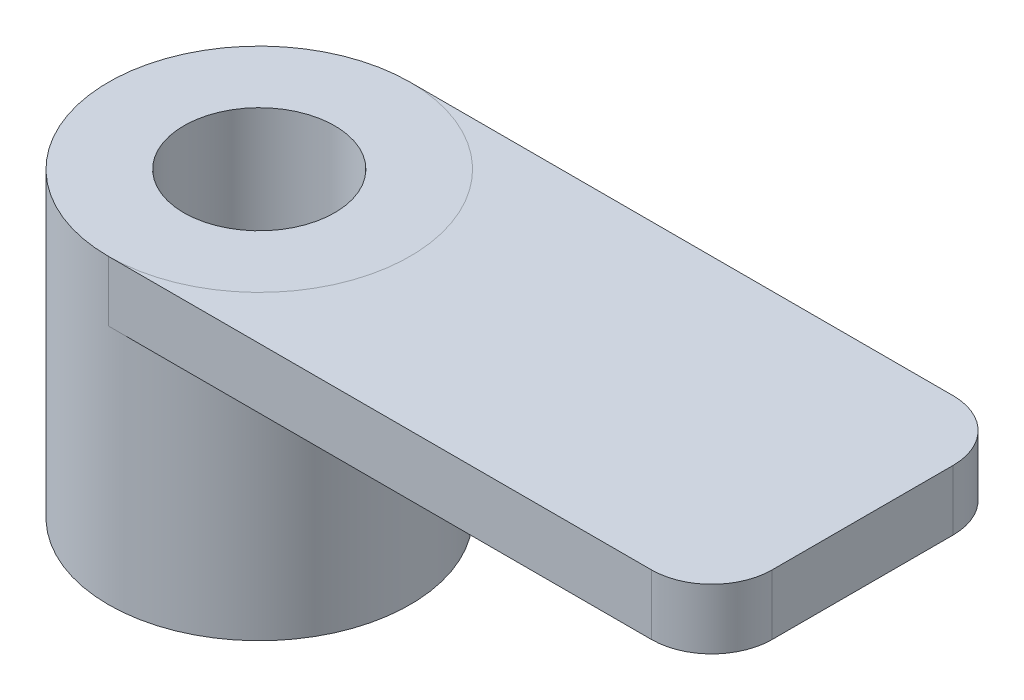
ISO-10303-21;
HEADER;
FILE_DESCRIPTION(('STEP AP214'),'2;1');
FILE_NAME('part.step','',(''),(''),'','','');
FILE_SCHEMA(('AUTOMOTIVE_DESIGN { 1 0 10303 214 1 1 1 1 }'));
ENDSEC;
DATA;
#1=APPLICATION_CONTEXT('core data for automotive mechanical design processes');
#2=APPLICATION_PROTOCOL_DEFINITION('international standard','automotive_design',2000,#1);
#3=PRODUCT_CONTEXT('',#1,'mechanical');
#4=PRODUCT('Part','Part','',(#3));
#5=PRODUCT_RELATED_PRODUCT_CATEGORY('part','',(#4));
#6=PRODUCT_DEFINITION_FORMATION('','',#4);
#7=PRODUCT_DEFINITION_CONTEXT('part definition',#1,'design');
#8=PRODUCT_DEFINITION('design','',#6,#7);
#9=PRODUCT_DEFINITION_SHAPE('','',#8);
#10=(LENGTH_UNIT() NAMED_UNIT(*) SI_UNIT(.MILLI.,.METRE.));
#11=(NAMED_UNIT(*) PLANE_ANGLE_UNIT() SI_UNIT($,.RADIAN.));
#12=(NAMED_UNIT(*) SI_UNIT($,.STERADIAN.) SOLID_ANGLE_UNIT());
#13=UNCERTAINTY_MEASURE_WITH_UNIT(LENGTH_MEASURE(1.E-05),#10,'distance_accuracy_value','');
#14=(GEOMETRIC_REPRESENTATION_CONTEXT(3) GLOBAL_UNCERTAINTY_ASSIGNED_CONTEXT((#13)) GLOBAL_UNIT_ASSIGNED_CONTEXT((#10,
#11,#12)) REPRESENTATION_CONTEXT('',''));
#15=CARTESIAN_POINT('',(0.,0.,0.));
#16=DIRECTION('',(0.,0.,1.));
#17=DIRECTION('',(1.,0.,0.));
#18=AXIS2_PLACEMENT_3D('',#15,#16,#17);
#19=CARTESIAN_POINT('',(0.,10.16,0.));
#20=DIRECTION('',(0.,1.,0.));
#21=DIRECTION('',(0.,0.,1.));
#22=AXIS2_PLACEMENT_3D('',#19,#20,#21);
#23=CYLINDRICAL_SURFACE('',#22,6.35);
#24=CARTESIAN_POINT('',(0.,12.7,0.));
#25=DIRECTION('',(0.,-1.,0.));
#26=DIRECTION('',(0.,0.,1.));
#27=AXIS2_PLACEMENT_3D('',#24,#25,#26);
#28=CIRCLE('',#27,6.35);
#29=CARTESIAN_POINT('',(0.,12.7,-6.35));
#30=VERTEX_POINT('',#29);
#31=CARTESIAN_POINT('',(0.,12.7,6.35));
#32=VERTEX_POINT('',#31);
#33=EDGE_CURVE('E124',#30,#32,#28,.T.);
#34=ORIENTED_EDGE('',*,*,#33,.F.);
#35=DIRECTION('',(0.,1.,0.));
#36=VECTOR('',#35,1.);
#37=CARTESIAN_POINT('',(0.,10.16,-6.35));
#38=LINE('',#37,#36);
#39=CARTESIAN_POINT('',(0.,10.16,-6.35));
#40=VERTEX_POINT('',#39);
#41=EDGE_CURVE('E106',#40,#30,#38,.T.);
#42=ORIENTED_EDGE('',*,*,#41,.F.);
#43=CARTESIAN_POINT('',(0.,10.16,0.));
#44=DIRECTION('',(0.,-1.,0.));
#45=DIRECTION('',(0.,0.,1.));
#46=AXIS2_PLACEMENT_3D('',#43,#44,#45);
#47=CIRCLE('',#46,6.35);
#48=CARTESIAN_POINT('',(0.,10.16,6.35));
#49=VERTEX_POINT('',#48);
#50=EDGE_CURVE('E111',#40,#49,#47,.T.);
#51=ORIENTED_EDGE('',*,*,#50,.T.);
#52=DIRECTION('',(0.,1.,0.));
#53=VECTOR('',#52,1.);
#54=CARTESIAN_POINT('',(0.,10.16,6.35));
#55=LINE('',#54,#53);
#56=EDGE_CURVE('E94',#49,#32,#55,.T.);
#57=ORIENTED_EDGE('',*,*,#56,.T.);
#58=EDGE_LOOP('',(#34,#42,#51,#57));
#59=FACE_BOUND('',#58,.T.);
#60=ADVANCED_FACE('F41',(#59),#23,.F.);
#61=CARTESIAN_POINT('',(0.,10.16,-6.35));
#62=DIRECTION('',(0.,0.,-1.));
#63=DIRECTION('',(-1.,0.,0.));
#64=AXIS2_PLACEMENT_3D('',#61,#62,#63);
#65=PLANE('',#64);
#66=DIRECTION('',(-1.,0.,0.));
#67=VECTOR('',#66,1.);
#68=CARTESIAN_POINT('',(0.,12.7,-6.35));
#69=LINE('',#68,#67);
#70=CARTESIAN_POINT('',(22.86,12.7,-6.35));
#71=VERTEX_POINT('',#70);
#72=EDGE_CURVE('E117',#71,#30,#69,.T.);
#73=ORIENTED_EDGE('',*,*,#72,.F.);
#74=DIRECTION('',(0.,1.,0.));
#75=VECTOR('',#74,1.);
#76=CARTESIAN_POINT('',(22.86,10.16,-6.35));
#77=LINE('',#76,#75);
#78=CARTESIAN_POINT('',(22.86,10.16,-6.35));
#79=VERTEX_POINT('',#78);
#80=EDGE_CURVE('E12',#71,#79,#77,.F.);
#81=ORIENTED_EDGE('',*,*,#80,.T.);
#82=DIRECTION('',(-1.,0.,0.));
#83=VECTOR('',#82,1.);
#84=CARTESIAN_POINT('',(0.,10.16,-6.35));
#85=LINE('',#84,#83);
#86=EDGE_CURVE('E107',#79,#40,#85,.T.);
#87=ORIENTED_EDGE('',*,*,#86,.T.);
#88=ORIENTED_EDGE('',*,*,#41,.T.);
#89=EDGE_LOOP('',(#73,#81,#87,#88));
#90=FACE_BOUND('',#89,.T.);
#91=ADVANCED_FACE('F150',(#90),#65,.T.);
#92=CARTESIAN_POINT('',(25.4,10.16,-6.35));
#93=DIRECTION('',(1.,0.,0.));
#94=DIRECTION('',(0.,0.,-1.));
#95=AXIS2_PLACEMENT_3D('',#92,#93,#94);
#96=PLANE('',#95);
#97=DIRECTION('',(0.,0.,-1.));
#98=VECTOR('',#97,1.);
#99=CARTESIAN_POINT('',(25.4,12.7,-6.35));
#100=LINE('',#99,#98);
#101=CARTESIAN_POINT('',(25.4,12.7,3.81));
#102=VERTEX_POINT('',#101);
#103=CARTESIAN_POINT('',(25.4,12.7,-3.81));
#104=VERTEX_POINT('',#103);
#105=EDGE_CURVE('E119',#102,#104,#100,.T.);
#106=ORIENTED_EDGE('',*,*,#105,.F.);
#107=DIRECTION('',(0.,1.,0.));
#108=VECTOR('',#107,1.);
#109=CARTESIAN_POINT('',(25.4,10.16,3.81));
#110=LINE('',#109,#108);
#111=CARTESIAN_POINT('',(25.4,10.16,3.81));
#112=VERTEX_POINT('',#111);
#113=EDGE_CURVE('E139',#102,#112,#110,.F.);
#114=ORIENTED_EDGE('',*,*,#113,.T.);
#115=DIRECTION('',(0.,0.,-1.));
#116=VECTOR('',#115,1.);
#117=CARTESIAN_POINT('',(25.4,10.16,-6.35));
#118=LINE('',#117,#116);
#119=CARTESIAN_POINT('',(25.4,10.16,-3.81));
#120=VERTEX_POINT('',#119);
#121=EDGE_CURVE('E113',#112,#120,#118,.T.);
#122=ORIENTED_EDGE('',*,*,#121,.T.);
#123=DIRECTION('',(0.,1.,0.));
#124=VECTOR('',#123,1.);
#125=CARTESIAN_POINT('',(25.4,10.16,-3.81));
#126=LINE('',#125,#124);
#127=EDGE_CURVE('E136',#120,#104,#126,.T.);
#128=ORIENTED_EDGE('',*,*,#127,.T.);
#129=EDGE_LOOP('',(#106,#114,#122,#128));
#130=FACE_BOUND('',#129,.T.);
#131=ADVANCED_FACE('F144',(#130),#96,.T.);
#132=CARTESIAN_POINT('',(25.4,10.16,6.35));
#133=DIRECTION('',(0.,0.,1.));
#134=DIRECTION('',(1.,0.,0.));
#135=AXIS2_PLACEMENT_3D('',#132,#133,#134);
#136=PLANE('',#135);
#137=DIRECTION('',(1.,0.,0.));
#138=VECTOR('',#137,1.);
#139=CARTESIAN_POINT('',(25.4,10.16,6.35));
#140=LINE('',#139,#138);
#141=CARTESIAN_POINT('',(22.86,10.16,6.35));
#142=VERTEX_POINT('',#141);
#143=EDGE_CURVE('E98',#49,#142,#140,.T.);
#144=ORIENTED_EDGE('',*,*,#143,.T.);
#145=DIRECTION('',(0.,1.,0.));
#146=VECTOR('',#145,1.);
#147=CARTESIAN_POINT('',(22.86,10.16,6.35));
#148=LINE('',#147,#146);
#149=CARTESIAN_POINT('',(22.86,12.7,6.35));
#150=VERTEX_POINT('',#149);
#151=EDGE_CURVE('E129',#142,#150,#148,.T.);
#152=ORIENTED_EDGE('',*,*,#151,.T.);
#153=DIRECTION('',(1.,0.,0.));
#154=VECTOR('',#153,1.);
#155=CARTESIAN_POINT('',(25.4,12.7,6.35));
#156=LINE('',#155,#154);
#157=EDGE_CURVE('E101',#32,#150,#156,.T.);
#158=ORIENTED_EDGE('',*,*,#157,.F.);
#159=ORIENTED_EDGE('',*,*,#56,.F.);
#160=EDGE_LOOP('',(#144,#152,#158,#159));
#161=FACE_BOUND('',#160,.T.);
#162=ADVANCED_FACE('F96',(#161),#136,.T.);
#163=CARTESIAN_POINT('',(0.,10.16,0.));
#164=DIRECTION('',(0.,1.,0.));
#165=DIRECTION('',(0.,0.,1.));
#166=AXIS2_PLACEMENT_3D('',#163,#164,#165);
#167=PLANE('',#166);
#168=ORIENTED_EDGE('',*,*,#121,.F.);
#169=CARTESIAN_POINT('',(22.86,10.16,3.81));
#170=DIRECTION('',(0.,1.,0.));
#171=DIRECTION('',(0.,0.,1.));
#172=AXIS2_PLACEMENT_3D('',#169,#170,#171);
#173=CIRCLE('',#172,2.54);
#174=EDGE_CURVE('E49',#112,#142,#173,.F.);
#175=ORIENTED_EDGE('',*,*,#174,.T.);
#176=ORIENTED_EDGE('',*,*,#143,.F.);
#177=ORIENTED_EDGE('',*,*,#50,.F.);
#178=ORIENTED_EDGE('',*,*,#86,.F.);
#179=CARTESIAN_POINT('',(22.86,10.16,-3.81));
#180=DIRECTION('',(0.,1.,0.));
#181=DIRECTION('',(0.,0.,1.));
#182=AXIS2_PLACEMENT_3D('',#179,#180,#181);
#183=CIRCLE('',#182,2.54);
#184=EDGE_CURVE('E61',#79,#120,#183,.F.);
#185=ORIENTED_EDGE('',*,*,#184,.T.);
#186=EDGE_LOOP('',(#168,#175,#176,#177,#178,#185));
#187=FACE_BOUND('',#186,.T.);
#188=ADVANCED_FACE('F110',(#187),#167,.F.);
#189=CARTESIAN_POINT('',(0.,12.7,0.));
#190=DIRECTION('',(0.,1.,0.));
#191=DIRECTION('',(0.,0.,1.));
#192=AXIS2_PLACEMENT_3D('',#189,#190,#191);
#193=PLANE('',#192);
#194=ORIENTED_EDGE('',*,*,#157,.T.);
#195=CARTESIAN_POINT('',(22.86,12.7,3.81));
#196=DIRECTION('',(0.,1.,0.));
#197=DIRECTION('',(0.,0.,1.));
#198=AXIS2_PLACEMENT_3D('',#195,#196,#197);
#199=CIRCLE('',#198,2.54);
#200=EDGE_CURVE('E134',#150,#102,#199,.T.);
#201=ORIENTED_EDGE('',*,*,#200,.T.);
#202=ORIENTED_EDGE('',*,*,#105,.T.);
#203=CARTESIAN_POINT('',(22.86,12.7,-3.81));
#204=DIRECTION('',(0.,1.,0.));
#205=DIRECTION('',(0.,0.,1.));
#206=AXIS2_PLACEMENT_3D('',#203,#204,#205);
#207=CIRCLE('',#206,2.54);
#208=EDGE_CURVE('E132',#104,#71,#207,.T.);
#209=ORIENTED_EDGE('',*,*,#208,.T.);
#210=ORIENTED_EDGE('',*,*,#72,.T.);
#211=ORIENTED_EDGE('',*,*,#33,.T.);
#212=EDGE_LOOP('',(#194,#201,#202,#209,#210,#211));
#213=FACE_BOUND('',#212,.T.);
#214=ADVANCED_FACE('F149',(#213),#193,.T.);
#215=CARTESIAN_POINT('',(22.86,10.16,3.81));
#216=DIRECTION('',(0.,1.,0.));
#217=DIRECTION('',(0.,0.,1.));
#218=AXIS2_PLACEMENT_3D('',#215,#216,#217);
#219=CYLINDRICAL_SURFACE('',#218,2.54);
#220=ORIENTED_EDGE('',*,*,#174,.F.);
#221=ORIENTED_EDGE('',*,*,#113,.F.);
#222=ORIENTED_EDGE('',*,*,#200,.F.);
#223=ORIENTED_EDGE('',*,*,#151,.F.);
#224=EDGE_LOOP('',(#220,#221,#222,#223));
#225=FACE_BOUND('',#224,.T.);
#226=ADVANCED_FACE('F147',(#225),#219,.T.);
#227=CARTESIAN_POINT('',(22.86,10.16,-3.81));
#228=DIRECTION('',(0.,1.,0.));
#229=DIRECTION('',(0.,0.,1.));
#230=AXIS2_PLACEMENT_3D('',#227,#228,#229);
#231=CYLINDRICAL_SURFACE('',#230,2.54);
#232=ORIENTED_EDGE('',*,*,#184,.F.);
#233=ORIENTED_EDGE('',*,*,#80,.F.);
#234=ORIENTED_EDGE('',*,*,#208,.F.);
#235=ORIENTED_EDGE('',*,*,#127,.F.);
#236=EDGE_LOOP('',(#232,#233,#234,#235));
#237=FACE_BOUND('',#236,.T.);
#238=ADVANCED_FACE('F43',(#237),#231,.T.);
#239=CLOSED_SHELL('',(#60,#91,#131,#162,#188,#214,#226,#238));
#240=MANIFOLD_SOLID_BREP('B2',#239);
#241=CARTESIAN_POINT('',(0.,12.7,0.));
#242=DIRECTION('',(0.,1.,0.));
#243=DIRECTION('',(0.,0.,1.));
#244=AXIS2_PLACEMENT_3D('',#241,#242,#243);
#245=PLANE('',#244);
#246=CARTESIAN_POINT('',(0.,12.7,0.));
#247=DIRECTION('',(0.,1.,0.));
#248=DIRECTION('',(0.,0.,1.));
#249=AXIS2_PLACEMENT_3D('',#246,#247,#248);
#250=CIRCLE('',#249,6.35);
#251=CARTESIAN_POINT('',(0.,12.7,6.35));
#252=VERTEX_POINT('',#251);
#253=EDGE_CURVE('E40',#252,#252,#250,.T.);
#254=ORIENTED_EDGE('',*,*,#253,.T.);
#255=EDGE_LOOP('',(#254));
#256=FACE_BOUND('',#255,.T.);
#257=CARTESIAN_POINT('',(0.,12.7,0.));
#258=DIRECTION('',(0.,1.,0.));
#259=DIRECTION('',(0.,0.,1.));
#260=AXIS2_PLACEMENT_3D('',#257,#258,#259);
#261=CIRCLE('',#260,3.175);
#262=CARTESIAN_POINT('',(0.,12.7,3.175));
#263=VERTEX_POINT('',#262);
#264=EDGE_CURVE('E228',#263,#263,#261,.T.);
#265=ORIENTED_EDGE('',*,*,#264,.F.);
#266=EDGE_LOOP('',(#265));
#267=FACE_BOUND('',#266,.T.);
#268=ADVANCED_FACE('F217',(#256,#267),#245,.T.);
#269=CARTESIAN_POINT('',(0.,0.,0.));
#270=DIRECTION('',(0.,1.,0.));
#271=DIRECTION('',(0.,0.,1.));
#272=AXIS2_PLACEMENT_3D('',#269,#270,#271);
#273=PLANE('',#272);
#274=CARTESIAN_POINT('',(0.,0.,0.));
#275=DIRECTION('',(0.,1.,0.));
#276=DIRECTION('',(0.,0.,1.));
#277=AXIS2_PLACEMENT_3D('',#274,#275,#276);
#278=CIRCLE('',#277,6.35);
#279=CARTESIAN_POINT('',(0.,0.,6.35));
#280=VERTEX_POINT('',#279);
#281=EDGE_CURVE('E221',#280,#280,#278,.T.);
#282=ORIENTED_EDGE('',*,*,#281,.F.);
#283=EDGE_LOOP('',(#282));
#284=FACE_BOUND('',#283,.T.);
#285=CARTESIAN_POINT('',(0.,0.,0.));
#286=DIRECTION('',(0.,1.,0.));
#287=DIRECTION('',(0.,0.,1.));
#288=AXIS2_PLACEMENT_3D('',#285,#286,#287);
#289=CIRCLE('',#288,3.175);
#290=CARTESIAN_POINT('',(0.,0.,3.175));
#291=VERTEX_POINT('',#290);
#292=EDGE_CURVE('E230',#291,#291,#289,.T.);
#293=ORIENTED_EDGE('',*,*,#292,.T.);
#294=EDGE_LOOP('',(#293));
#295=FACE_BOUND('',#294,.T.);
#296=ADVANCED_FACE('F240',(#284,#295),#273,.F.);
#297=CARTESIAN_POINT('',(0.,12.7,0.));
#298=DIRECTION('',(0.,-1.,0.));
#299=DIRECTION('',(0.,0.,-1.));
#300=AXIS2_PLACEMENT_3D('',#297,#298,#299);
#301=CYLINDRICAL_SURFACE('',#300,6.35);
#302=ORIENTED_EDGE('',*,*,#253,.F.);
#303=EDGE_LOOP('',(#302));
#304=FACE_BOUND('',#303,.T.);
#305=ORIENTED_EDGE('',*,*,#281,.T.);
#306=EDGE_LOOP('',(#305));
#307=FACE_BOUND('',#306,.T.);
#308=ADVANCED_FACE('F219',(#304,#307),#301,.T.);
#309=CARTESIAN_POINT('',(0.,12.7,0.));
#310=DIRECTION('',(0.,-1.,0.));
#311=DIRECTION('',(0.,0.,-1.));
#312=AXIS2_PLACEMENT_3D('',#309,#310,#311);
#313=CYLINDRICAL_SURFACE('',#312,3.175);
#314=ORIENTED_EDGE('',*,*,#264,.T.);
#315=EDGE_LOOP('',(#314));
#316=FACE_BOUND('',#315,.T.);
#317=ORIENTED_EDGE('',*,*,#292,.F.);
#318=EDGE_LOOP('',(#317));
#319=FACE_BOUND('',#318,.T.);
#320=ADVANCED_FACE('F236',(#316,#319),#313,.F.);
#321=CLOSED_SHELL('',(#268,#296,#308,#320));
#322=MANIFOLD_SOLID_BREP('B6',#321);
#323=ADVANCED_BREP_SHAPE_REPRESENTATION('',(#18,#240,#322),#14);
#324=SHAPE_DEFINITION_REPRESENTATION(#9,#323);
ENDSEC;
END-ISO-10303-21;
